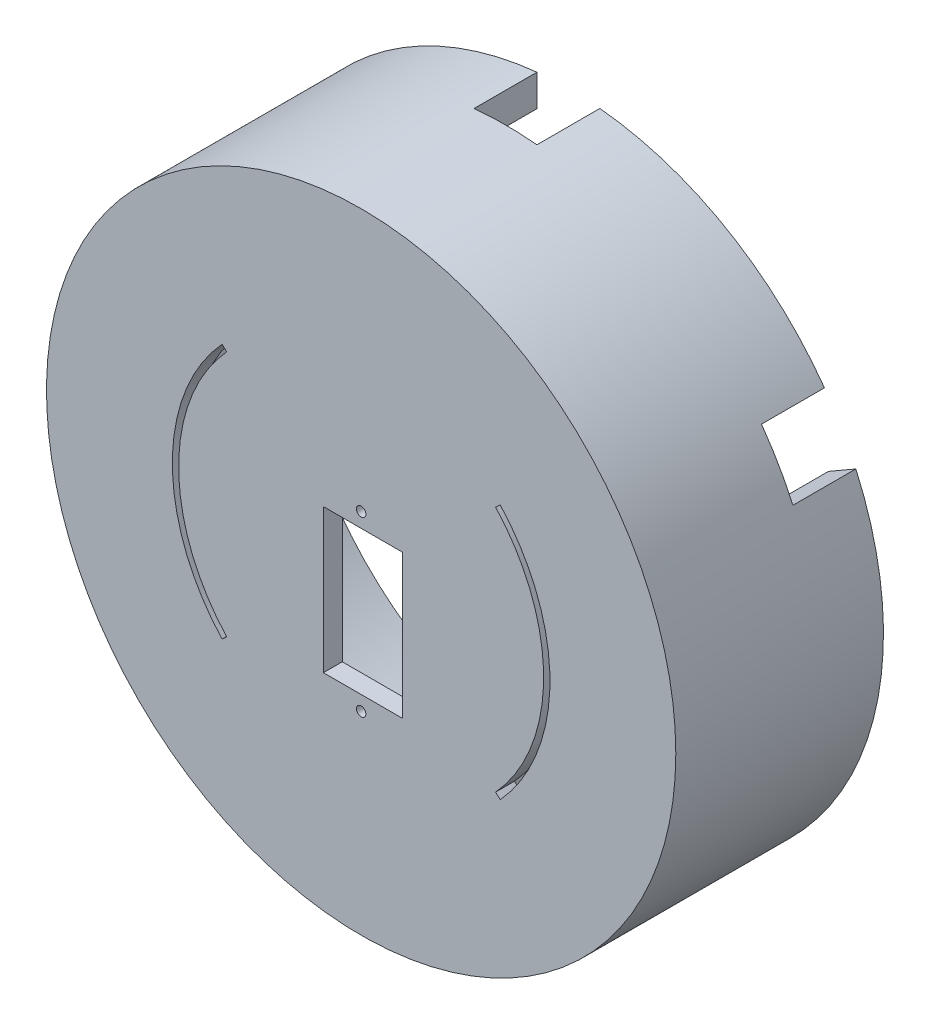
ISO-10303-21;
HEADER;
FILE_DESCRIPTION(('STEP AP214'),'2;1');
FILE_NAME('part.step','',(''),(''),'','','');
FILE_SCHEMA(('AUTOMOTIVE_DESIGN { 1 0 10303 214 1 1 1 1 }'));
ENDSEC;
DATA;
#1=APPLICATION_CONTEXT('core data for automotive mechanical design processes');
#2=APPLICATION_PROTOCOL_DEFINITION('international standard','automotive_design',2000,#1);
#3=PRODUCT_CONTEXT('',#1,'mechanical');
#4=PRODUCT('Part','Part','',(#3));
#5=PRODUCT_RELATED_PRODUCT_CATEGORY('part','',(#4));
#6=PRODUCT_DEFINITION_FORMATION('','',#4);
#7=PRODUCT_DEFINITION_CONTEXT('part definition',#1,'design');
#8=PRODUCT_DEFINITION('design','',#6,#7);
#9=PRODUCT_DEFINITION_SHAPE('','',#8);
#10=(LENGTH_UNIT() NAMED_UNIT(*) SI_UNIT(.MILLI.,.METRE.));
#11=(NAMED_UNIT(*) PLANE_ANGLE_UNIT() SI_UNIT($,.RADIAN.));
#12=(NAMED_UNIT(*) SI_UNIT($,.STERADIAN.) SOLID_ANGLE_UNIT());
#13=UNCERTAINTY_MEASURE_WITH_UNIT(LENGTH_MEASURE(1.E-05),#10,'distance_accuracy_value','');
#14=(GEOMETRIC_REPRESENTATION_CONTEXT(3) GLOBAL_UNCERTAINTY_ASSIGNED_CONTEXT((#13)) GLOBAL_UNIT_ASSIGNED_CONTEXT((#10,
#11,#12)) REPRESENTATION_CONTEXT('',''));
#15=CARTESIAN_POINT('',(0.,0.,0.));
#16=DIRECTION('',(0.,0.,1.));
#17=DIRECTION('',(1.,0.,0.));
#18=AXIS2_PLACEMENT_3D('',#15,#16,#17);
#19=CARTESIAN_POINT('',(0.299999999999826,16.8600000000008,0.));
#20=DIRECTION('',(0.,0.,1.));
#21=DIRECTION('',(1.,0.,0.));
#22=AXIS2_PLACEMENT_3D('',#19,#20,#21);
#23=PLANE('',#22);
#24=DIRECTION('',(-0.736746247058359,-0.676169333410962,0.));
#25=VECTOR('',#24,1.);
#26=CARTESIAN_POINT('',(0.300000000005249,16.8599999999949,0.));
#27=LINE('',#26,#25);
#28=CARTESIAN_POINT('',(22.4023874117628,37.1450800023299,0.));
#29=VERTEX_POINT('',#28);
#30=CARTESIAN_POINT('',(21.6656411647044,36.4689106689189,0.));
#31=VERTEX_POINT('',#30);
#32=EDGE_CURVE('E287',#29,#31,#27,.T.);
#33=ORIENTED_EDGE('',*,*,#32,.T.);
#34=CARTESIAN_POINT('',(0.300000000011957,16.860000000001,0.));
#35=DIRECTION('',(0.,0.,1.));
#36=DIRECTION('',(1.,0.,0.));
#37=AXIS2_PLACEMENT_3D('',#34,#35,#36);
#38=CIRCLE('',#37,29.0000000000001);
#39=CARTESIAN_POINT('',(21.6656411647044,-2.74891066891696,0.));
#40=VERTEX_POINT('',#39);
#41=EDGE_CURVE('E293',#31,#40,#38,.F.);
#42=ORIENTED_EDGE('',*,*,#41,.T.);
#43=DIRECTION('',(0.736746247058382,-0.676169333410936,0.));
#44=VECTOR('',#43,1.);
#45=CARTESIAN_POINT('',(0.300000000004796,16.8600000000062,0.));
#46=LINE('',#45,#44);
#47=CARTESIAN_POINT('',(22.4023874117628,-3.4250800023279,0.));
#48=VERTEX_POINT('',#47);
#49=EDGE_CURVE('E281',#40,#48,#46,.T.);
#50=ORIENTED_EDGE('',*,*,#49,.T.);
#51=CARTESIAN_POINT('',(0.300000000011957,16.860000000001,0.));
#52=DIRECTION('',(0.,0.,1.));
#53=DIRECTION('',(1.,0.,0.));
#54=AXIS2_PLACEMENT_3D('',#51,#52,#53);
#55=CIRCLE('',#54,30.0000000000001);
#56=EDGE_CURVE('E230',#48,#29,#55,.T.);
#57=ORIENTED_EDGE('',*,*,#56,.T.);
#58=EDGE_LOOP('',(#33,#42,#50,#57));
#59=FACE_BOUND('',#58,.T.);
#60=DIRECTION('',(0.736746247058359,0.676169333410962,0.));
#61=VECTOR('',#60,1.);
#62=CARTESIAN_POINT('',(0.300000000005277,16.8599999999948,0.));
#63=LINE('',#62,#61);
#64=CARTESIAN_POINT('',(-21.8023874117388,-3.42508000232792,0.));
#65=VERTEX_POINT('',#64);
#66=CARTESIAN_POINT('',(-21.0656411646805,-2.74891066891696,0.));
#67=VERTEX_POINT('',#66);
#68=EDGE_CURVE('E280',#65,#67,#63,.T.);
#69=ORIENTED_EDGE('',*,*,#68,.T.);
#70=CARTESIAN_POINT('',(0.300000000011957,16.860000000001,0.));
#71=DIRECTION('',(0.,0.,1.));
#72=DIRECTION('',(1.,0.,0.));
#73=AXIS2_PLACEMENT_3D('',#70,#71,#72);
#74=CIRCLE('',#73,29.0000000000001);
#75=CARTESIAN_POINT('',(-21.0656411646805,36.4689106689189,0.));
#76=VERTEX_POINT('',#75);
#77=EDGE_CURVE('E284',#67,#76,#74,.F.);
#78=ORIENTED_EDGE('',*,*,#77,.T.);
#79=DIRECTION('',(-0.736746247058359,0.676169333410962,0.));
#80=VECTOR('',#79,1.);
#81=CARTESIAN_POINT('',(0.300000000005497,16.8600000000069,0.));
#82=LINE('',#81,#80);
#83=CARTESIAN_POINT('',(-21.8023874117388,37.1450800023299,0.));
#84=VERTEX_POINT('',#83);
#85=EDGE_CURVE('E254',#76,#84,#82,.T.);
#86=ORIENTED_EDGE('',*,*,#85,.T.);
#87=CARTESIAN_POINT('',(0.300000000011957,16.860000000001,0.));
#88=DIRECTION('',(0.,0.,1.));
#89=DIRECTION('',(1.,0.,0.));
#90=AXIS2_PLACEMENT_3D('',#87,#88,#89);
#91=CIRCLE('',#90,30.0000000000001);
#92=EDGE_CURVE('E278',#84,#65,#91,.T.);
#93=ORIENTED_EDGE('',*,*,#92,.T.);
#94=EDGE_LOOP('',(#69,#78,#86,#93));
#95=FACE_BOUND('',#94,.T.);
#96=CARTESIAN_POINT('',(0.299999999999826,16.8600000000008,0.));
#97=DIRECTION('',(0.,0.,-1.));
#98=DIRECTION('',(-1.,0.,0.));
#99=AXIS2_PLACEMENT_3D('',#96,#97,#98);
#100=CIRCLE('',#99,45.);
#101=CARTESIAN_POINT('',(-44.7000000000002,16.8600000000008,0.));
#102=VERTEX_POINT('',#101);
#103=EDGE_CURVE('E407',#102,#102,#100,.T.);
#104=ORIENTED_EDGE('',*,*,#103,.T.);
#105=EDGE_LOOP('',(#104));
#106=FACE_BOUND('',#105,.T.);
#107=DIRECTION('',(0.,1.,0.));
#108=VECTOR('',#107,1.);
#109=CARTESIAN_POINT('',(-5.70000000000014,2.22044604925031E-13,0.));
#110=LINE('',#109,#108);
#111=CARTESIAN_POINT('',(-5.70000000000014,2.22044604925031E-13,0.));
#112=VERTEX_POINT('',#111);
#113=CARTESIAN_POINT('',(-5.70000000000014,22.8600000000002,0.));
#114=VERTEX_POINT('',#113);
#115=EDGE_CURVE('E296',#112,#114,#110,.T.);
#116=ORIENTED_EDGE('',*,*,#115,.F.);
#117=DIRECTION('',(-1.,0.,0.));
#118=VECTOR('',#117,1.);
#119=CARTESIAN_POINT('',(-5.70000000000014,2.22044604925031E-13,0.));
#120=LINE('',#119,#118);
#121=CARTESIAN_POINT('',(6.89999999999968,2.18575157973078E-13,0.));
#122=VERTEX_POINT('',#121);
#123=EDGE_CURVE('E311',#122,#112,#120,.T.);
#124=ORIENTED_EDGE('',*,*,#123,.F.);
#125=DIRECTION('',(0.,-1.,0.));
#126=VECTOR('',#125,1.);
#127=CARTESIAN_POINT('',(6.89999999999968,2.18575157973078E-13,0.));
#128=LINE('',#127,#126);
#129=CARTESIAN_POINT('',(6.89999999999968,22.8600000000002,0.));
#130=VERTEX_POINT('',#129);
#131=EDGE_CURVE('E328',#130,#122,#128,.T.);
#132=ORIENTED_EDGE('',*,*,#131,.F.);
#133=DIRECTION('',(1.,0.,0.));
#134=VECTOR('',#133,1.);
#135=CARTESIAN_POINT('',(-5.70000000000014,22.8600000000002,0.));
#136=LINE('',#135,#134);
#137=EDGE_CURVE('E322',#114,#130,#136,.T.);
#138=ORIENTED_EDGE('',*,*,#137,.F.);
#139=EDGE_LOOP('',(#116,#124,#132,#138));
#140=FACE_BOUND('',#139,.T.);
#141=CARTESIAN_POINT('',(0.299999999999826,-2.32,0.));
#142=DIRECTION('',(0.,0.,-1.));
#143=DIRECTION('',(-1.,0.,0.));
#144=AXIS2_PLACEMENT_3D('',#141,#142,#143);
#145=CIRCLE('',#144,0.75);
#146=CARTESIAN_POINT('',(-0.450000000000174,-2.32,0.));
#147=VERTEX_POINT('',#146);
#148=EDGE_CURVE('E294',#147,#147,#145,.T.);
#149=ORIENTED_EDGE('',*,*,#148,.F.);
#150=EDGE_LOOP('',(#149));
#151=FACE_BOUND('',#150,.T.);
#152=CARTESIAN_POINT('',(0.299999999999826,25.18,0.));
#153=DIRECTION('',(0.,0.,-1.));
#154=DIRECTION('',(-1.,0.,0.));
#155=AXIS2_PLACEMENT_3D('',#152,#153,#154);
#156=CIRCLE('',#155,0.75);
#157=CARTESIAN_POINT('',(-0.450000000000174,25.18,0.));
#158=VERTEX_POINT('',#157);
#159=EDGE_CURVE('E305',#158,#158,#156,.T.);
#160=ORIENTED_EDGE('',*,*,#159,.F.);
#161=EDGE_LOOP('',(#160));
#162=FACE_BOUND('',#161,.T.);
#163=ADVANCED_FACE('F39',(#59,#95,#106,#140,#151,#162),#23,.F.);
#164=CARTESIAN_POINT('',(0.299999999999826,16.8600000000008,-30.));
#165=DIRECTION('',(0.,0.,-1.));
#166=DIRECTION('',(-1.,0.,0.));
#167=AXIS2_PLACEMENT_3D('',#164,#165,#166);
#168=PLANE('',#167);
#169=DIRECTION('',(0.,1.,0.));
#170=VECTOR('',#169,1.);
#171=CARTESIAN_POINT('',(-4.76515575525249,-37.5201500632272,-30.));
#172=LINE('',#171,#170);
#173=CARTESIAN_POINT('',(-4.76515575525249,-32.8827803522778,-30.));
#174=VERTEX_POINT('',#173);
#175=CARTESIAN_POINT('',(-4.76515575525249,-27.8540268503628,-30.));
#176=VERTEX_POINT('',#175);
#177=EDGE_CURVE('E348',#174,#176,#172,.T.);
#178=ORIENTED_EDGE('',*,*,#177,.F.);
#179=CARTESIAN_POINT('',(0.299999999999826,16.8600000000008,-30.));
#180=DIRECTION('',(0.,0.,-1.));
#181=DIRECTION('',(-1.,0.,0.));
#182=AXIS2_PLACEMENT_3D('',#179,#180,#181);
#183=CIRCLE('',#182,50.);
#184=CARTESIAN_POINT('',(-45.2572757332887,37.464238101933,-30.));
#185=VERTEX_POINT('',#184);
#186=EDGE_CURVE('E418',#174,#185,#183,.T.);
#187=ORIENTED_EDGE('',*,*,#186,.T.);
#188=DIRECTION('',(-0.866025403784439,0.5,0.));
#189=VECTOR('',#188,1.);
#190=CARTESIAN_POINT('',(-49.2620135387394,39.7763745519439,-30.));
#191=LINE('',#190,#189);
#192=CARTESIAN_POINT('',(-40.9035226515969,34.9505975882331,-30.));
#193=VERTEX_POINT('',#192);
#194=EDGE_CURVE('E362',#193,#185,#191,.T.);
#195=ORIENTED_EDGE('',*,*,#194,.F.);
#196=CARTESIAN_POINT('',(0.299999999999826,16.8600000000008,-30.));
#197=DIRECTION('',(0.,0.,-1.));
#198=DIRECTION('',(-1.,0.,0.));
#199=AXIS2_PLACEMENT_3D('',#196,#197,#198);
#200=CIRCLE('',#199,45.);
#201=EDGE_CURVE('E410',#176,#193,#200,.T.);
#202=ORIENTED_EDGE('',*,*,#201,.F.);
#203=EDGE_LOOP('',(#178,#187,#195,#202));
#204=FACE_BOUND('',#203,.T.);
#205=ADVANCED_FACE('F517',(#204),#168,.T.);
#206=DIRECTION('',(0.866025403784439,0.5,0.));
#207=VECTOR('',#206,1.);
#208=CARTESIAN_POINT('',(44.9271692939914,48.3237755112857,-30.));
#209=LINE('',#208,#207);
#210=CARTESIAN_POINT('',(36.5686784068489,43.4979985475749,-30.));
#211=VERTEX_POINT('',#210);
#212=CARTESIAN_POINT('',(40.9224314885407,46.0116390612749,-30.));
#213=VERTEX_POINT('',#212);
#214=EDGE_CURVE('E347',#211,#213,#209,.T.);
#215=ORIENTED_EDGE('',*,*,#214,.F.);
#216=CARTESIAN_POINT('',(5.23484424474753,61.5885961358072,-30.));
#217=VERTEX_POINT('',#216);
#218=EDGE_CURVE('E467',#217,#211,#200,.T.);
#219=ORIENTED_EDGE('',*,*,#218,.F.);
#220=DIRECTION('',(0.,-1.,0.));
#221=VECTOR('',#220,1.);
#222=CARTESIAN_POINT('',(5.23484424474753,56.0497664051937,-30.));
#223=LINE('',#222,#221);
#224=CARTESIAN_POINT('',(5.23484424474753,66.6158771632071,-30.));
#225=VERTEX_POINT('',#224);
#226=EDGE_CURVE('E360',#225,#217,#223,.T.);
#227=ORIENTED_EDGE('',*,*,#226,.F.);
#228=EDGE_CURVE('E497',#225,#213,#183,.T.);
#229=ORIENTED_EDGE('',*,*,#228,.T.);
#230=EDGE_LOOP('',(#215,#219,#227,#229));
#231=FACE_BOUND('',#230,.T.);
#232=ADVANCED_FACE('F500',(#231),#168,.T.);
#233=DIRECTION('',(0.,1.,0.));
#234=VECTOR('',#233,1.);
#235=CARTESIAN_POINT('',(-4.76515575525249,56.0497664051937,-30.));
#236=LINE('',#235,#234);
#237=CARTESIAN_POINT('',(-4.76515575525249,61.5740268503643,-30.));
#238=VERTEX_POINT('',#237);
#239=CARTESIAN_POINT('',(-4.76515575525249,66.6027803522794,-30.));
#240=VERTEX_POINT('',#239);
#241=EDGE_CURVE('E358',#238,#240,#236,.T.);
#242=ORIENTED_EDGE('',*,*,#241,.F.);
#243=CARTESIAN_POINT('',(-35.8909052802884,43.603566983356,-30.));
#244=VERTEX_POINT('',#243);
#245=EDGE_CURVE('E412',#244,#238,#200,.T.);
#246=ORIENTED_EDGE('',*,*,#245,.F.);
#247=DIRECTION('',(0.866025403784438,-0.500000000000001,0.));
#248=VECTOR('',#247,1.);
#249=CARTESIAN_POINT('',(-44.2620135387394,48.4366285897882,-30.));
#250=LINE('',#249,#248);
#251=CARTESIAN_POINT('',(-40.2459335623167,46.1179437343136,-30.));
#252=VERTEX_POINT('',#251);
#253=EDGE_CURVE('E368',#252,#244,#250,.T.);
#254=ORIENTED_EDGE('',*,*,#253,.F.);
#255=EDGE_CURVE('E416',#252,#240,#183,.T.);
#256=ORIENTED_EDGE('',*,*,#255,.T.);
#257=EDGE_LOOP('',(#242,#246,#254,#256));
#258=FACE_BOUND('',#257,.T.);
#259=ADVANCED_FACE('F480',(#258),#168,.T.);
#260=CARTESIAN_POINT('',(0.299999999999826,16.8600000000008,3.));
#261=DIRECTION('',(0.,0.,-1.));
#262=DIRECTION('',(-1.,0.,0.));
#263=AXIS2_PLACEMENT_3D('',#260,#261,#262);
#264=CYLINDRICAL_SURFACE('',#263,50.);
#265=ORIENTED_EDGE('',*,*,#186,.F.);
#266=DIRECTION('',(0.,0.,-1.));
#267=VECTOR('',#266,1.);
#268=CARTESIAN_POINT('',(-4.76515575525249,-32.8827803522778,3.));
#269=LINE('',#268,#267);
#270=CARTESIAN_POINT('',(-4.76515575525249,-32.8827803522778,-20.));
#271=VERTEX_POINT('',#270);
#272=EDGE_CURVE('E403',#174,#271,#269,.F.);
#273=ORIENTED_EDGE('',*,*,#272,.T.);
#274=CARTESIAN_POINT('',(0.299999999999826,16.8600000000008,-20.));
#275=DIRECTION('',(0.,0.,1.));
#276=DIRECTION('',(1.,0.,0.));
#277=AXIS2_PLACEMENT_3D('',#274,#275,#276);
#278=CIRCLE('',#277,50.);
#279=CARTESIAN_POINT('',(5.23484424474751,-32.8958771632056,-20.));
#280=VERTEX_POINT('',#279);
#281=EDGE_CURVE('E400',#271,#280,#278,.T.);
#282=ORIENTED_EDGE('',*,*,#281,.T.);
#283=DIRECTION('',(0.,0.,-1.));
#284=VECTOR('',#283,1.);
#285=CARTESIAN_POINT('',(5.23484424474751,-32.8958771632056,3.));
#286=LINE('',#285,#284);
#287=CARTESIAN_POINT('',(5.23484424474751,-32.8958771632056,-30.));
#288=VERTEX_POINT('',#287);
#289=EDGE_CURVE('E405',#280,#288,#286,.T.);
#290=ORIENTED_EDGE('',*,*,#289,.T.);
#291=CARTESIAN_POINT('',(45.9110893175687,37.3448366179666,-30.));
#292=VERTEX_POINT('',#291);
#293=EDGE_CURVE('E420',#292,#288,#183,.T.);
#294=ORIENTED_EDGE('',*,*,#293,.F.);
#295=DIRECTION('',(0.,0.,-1.));
#296=VECTOR('',#295,1.);
#297=CARTESIAN_POINT('',(45.9110893175687,37.3448366179666,3.));
#298=LINE('',#297,#296);
#299=CARTESIAN_POINT('',(45.9110893175687,37.3448366179666,-20.));
#300=VERTEX_POINT('',#299);
#301=EDGE_CURVE('E398',#292,#300,#298,.F.);
#302=ORIENTED_EDGE('',*,*,#301,.T.);
#303=CARTESIAN_POINT('',(0.299999999999826,16.8600000000008,-20.));
#304=DIRECTION('',(0.,0.,-1.));
#305=DIRECTION('',(-1.,0.,0.));
#306=AXIS2_PLACEMENT_3D('',#303,#304,#305);
#307=CIRCLE('',#306,50.);
#308=CARTESIAN_POINT('',(40.9224314885407,46.0116390612749,-20.));
#309=VERTEX_POINT('',#308);
#310=EDGE_CURVE('E393',#309,#300,#307,.T.);
#311=ORIENTED_EDGE('',*,*,#310,.F.);
#312=DIRECTION('',(0.,0.,-1.));
#313=VECTOR('',#312,1.);
#314=CARTESIAN_POINT('',(40.9224314885407,46.0116390612749,3.));
#315=LINE('',#314,#313);
#316=EDGE_CURVE('E392',#309,#213,#315,.T.);
#317=ORIENTED_EDGE('',*,*,#316,.T.);
#318=ORIENTED_EDGE('',*,*,#228,.F.);
#319=DIRECTION('',(0.,0.,-1.));
#320=VECTOR('',#319,1.);
#321=CARTESIAN_POINT('',(5.23484424474753,66.6158771632071,3.));
#322=LINE('',#321,#320);
#323=CARTESIAN_POINT('',(5.23484424474753,66.6158771632071,-20.));
#324=VERTEX_POINT('',#323);
#325=EDGE_CURVE('E383',#225,#324,#322,.F.);
#326=ORIENTED_EDGE('',*,*,#325,.T.);
#327=CARTESIAN_POINT('',(0.299999999999826,16.8600000000008,-20.));
#328=DIRECTION('',(0.,0.,1.));
#329=DIRECTION('',(1.,0.,0.));
#330=AXIS2_PLACEMENT_3D('',#327,#328,#329);
#331=CIRCLE('',#330,50.);
#332=CARTESIAN_POINT('',(-4.76515575525249,66.6027803522794,-20.));
#333=VERTEX_POINT('',#332);
#334=EDGE_CURVE('E385',#324,#333,#331,.T.);
#335=ORIENTED_EDGE('',*,*,#334,.T.);
#336=DIRECTION('',(0.,0.,-1.));
#337=VECTOR('',#336,1.);
#338=CARTESIAN_POINT('',(-4.76515575525249,66.6027803522794,3.));
#339=LINE('',#338,#337);
#340=EDGE_CURVE('E387',#333,#240,#339,.T.);
#341=ORIENTED_EDGE('',*,*,#340,.T.);
#342=ORIENTED_EDGE('',*,*,#255,.F.);
#343=DIRECTION('',(0.,0.,-1.));
#344=VECTOR('',#343,1.);
#345=CARTESIAN_POINT('',(-40.2459335623167,46.1179437343136,3.));
#346=LINE('',#345,#344);
#347=CARTESIAN_POINT('',(-40.2459335623167,46.1179437343136,-20.));
#348=VERTEX_POINT('',#347);
#349=EDGE_CURVE('E378',#252,#348,#346,.F.);
#350=ORIENTED_EDGE('',*,*,#349,.T.);
#351=CARTESIAN_POINT('',(0.299999999999826,16.8600000000008,-20.));
#352=DIRECTION('',(0.,0.,-1.));
#353=DIRECTION('',(-1.,0.,0.));
#354=AXIS2_PLACEMENT_3D('',#351,#352,#353);
#355=CIRCLE('',#354,50.);
#356=CARTESIAN_POINT('',(-45.2572757332887,37.464238101933,-20.));
#357=VERTEX_POINT('',#356);
#358=EDGE_CURVE('E341',#357,#348,#355,.T.);
#359=ORIENTED_EDGE('',*,*,#358,.F.);
#360=DIRECTION('',(0.,0.,-1.));
#361=VECTOR('',#360,1.);
#362=CARTESIAN_POINT('',(-45.2572757332887,37.464238101933,3.));
#363=LINE('',#362,#361);
#364=EDGE_CURVE('E376',#357,#185,#363,.T.);
#365=ORIENTED_EDGE('',*,*,#364,.T.);
#366=EDGE_LOOP('',(#265,#273,#282,#290,#294,#302,#311,#317,#318,#326,#335,#341,#342,#350,#359,#365));
#367=FACE_BOUND('',#366,.T.);
#368=CARTESIAN_POINT('',(0.299999999999826,16.8600000000008,3.));
#369=DIRECTION('',(0.,0.,1.));
#370=DIRECTION('',(1.,0.,0.));
#371=AXIS2_PLACEMENT_3D('',#368,#369,#370);
#372=CIRCLE('',#371,50.);
#373=CARTESIAN_POINT('',(50.2999999999998,16.8600000000008,3.));
#374=VERTEX_POINT('',#373);
#375=EDGE_CURVE('E423',#374,#374,#372,.T.);
#376=ORIENTED_EDGE('',*,*,#375,.F.);
#377=EDGE_LOOP('',(#376));
#378=FACE_BOUND('',#377,.T.);
#379=ADVANCED_FACE('F41',(#367,#378),#264,.T.);
#380=CARTESIAN_POINT('',(0.299999999999826,16.8600000000008,3.));
#381=DIRECTION('',(0.,0.,1.));
#382=DIRECTION('',(1.,0.,0.));
#383=AXIS2_PLACEMENT_3D('',#380,#381,#382);
#384=PLANE('',#383);
#385=CARTESIAN_POINT('',(0.300000000011957,16.860000000001,3.));
#386=DIRECTION('',(0.,0.,-1.));
#387=DIRECTION('',(1.,0.,0.));
#388=AXIS2_PLACEMENT_3D('',#385,#386,#387);
#389=CIRCLE('',#388,29.0000000000001);
#390=CARTESIAN_POINT('',(21.6656411647044,36.4689106689189,3.));
#391=VERTEX_POINT('',#390);
#392=CARTESIAN_POINT('',(21.6656411647044,-2.74891066891696,3.));
#393=VERTEX_POINT('',#392);
#394=EDGE_CURVE('E241',#391,#393,#389,.T.);
#395=ORIENTED_EDGE('',*,*,#394,.F.);
#396=DIRECTION('',(-0.736746247058359,-0.676169333410962,0.));
#397=VECTOR('',#396,1.);
#398=CARTESIAN_POINT('',(21.6656411647044,36.4689106689189,3.));
#399=LINE('',#398,#397);
#400=CARTESIAN_POINT('',(22.4023874117628,37.1450800023299,3.));
#401=VERTEX_POINT('',#400);
#402=EDGE_CURVE('E246',#401,#391,#399,.T.);
#403=ORIENTED_EDGE('',*,*,#402,.F.);
#404=CARTESIAN_POINT('',(0.300000000011957,16.860000000001,3.));
#405=DIRECTION('',(0.,0.,1.));
#406=DIRECTION('',(1.,0.,0.));
#407=AXIS2_PLACEMENT_3D('',#404,#405,#406);
#408=CIRCLE('',#407,30.0000000000001);
#409=CARTESIAN_POINT('',(22.4023874117628,-3.4250800023279,3.));
#410=VERTEX_POINT('',#409);
#411=EDGE_CURVE('E228',#410,#401,#408,.T.);
#412=ORIENTED_EDGE('',*,*,#411,.F.);
#413=DIRECTION('',(0.736746247058382,-0.676169333410936,0.));
#414=VECTOR('',#413,1.);
#415=CARTESIAN_POINT('',(21.6656411647044,-2.74891066891696,3.));
#416=LINE('',#415,#414);
#417=EDGE_CURVE('E236',#393,#410,#416,.T.);
#418=ORIENTED_EDGE('',*,*,#417,.F.);
#419=EDGE_LOOP('',(#395,#403,#412,#418));
#420=FACE_BOUND('',#419,.T.);
#421=CARTESIAN_POINT('',(0.300000000011957,16.860000000001,3.));
#422=DIRECTION('',(0.,0.,-1.));
#423=DIRECTION('',(1.,0.,0.));
#424=AXIS2_PLACEMENT_3D('',#421,#422,#423);
#425=CIRCLE('',#424,29.0000000000001);
#426=CARTESIAN_POINT('',(-21.0656411646805,-2.74891066891696,3.));
#427=VERTEX_POINT('',#426);
#428=CARTESIAN_POINT('',(-21.0656411646805,36.4689106689189,3.));
#429=VERTEX_POINT('',#428);
#430=EDGE_CURVE('E275',#427,#429,#425,.T.);
#431=ORIENTED_EDGE('',*,*,#430,.F.);
#432=DIRECTION('',(0.736746247058359,0.676169333410961,0.));
#433=VECTOR('',#432,1.);
#434=CARTESIAN_POINT('',(-21.8023874117388,-3.42508000232792,3.));
#435=LINE('',#434,#433);
#436=CARTESIAN_POINT('',(-21.8023874117388,-3.42508000232792,3.));
#437=VERTEX_POINT('',#436);
#438=EDGE_CURVE('E260',#437,#427,#435,.T.);
#439=ORIENTED_EDGE('',*,*,#438,.F.);
#440=CARTESIAN_POINT('',(0.300000000011957,16.860000000001,3.));
#441=DIRECTION('',(0.,0.,1.));
#442=DIRECTION('',(1.,0.,0.));
#443=AXIS2_PLACEMENT_3D('',#440,#441,#442);
#444=CIRCLE('',#443,30.0000000000001);
#445=CARTESIAN_POINT('',(-21.8023874117388,37.1450800023299,3.));
#446=VERTEX_POINT('',#445);
#447=EDGE_CURVE('E269',#446,#437,#444,.T.);
#448=ORIENTED_EDGE('',*,*,#447,.F.);
#449=DIRECTION('',(-0.736746247058359,0.676169333410962,0.));
#450=VECTOR('',#449,1.);
#451=CARTESIAN_POINT('',(-21.8023874117388,37.1450800023299,3.));
#452=LINE('',#451,#450);
#453=EDGE_CURVE('E266',#429,#446,#452,.T.);
#454=ORIENTED_EDGE('',*,*,#453,.F.);
#455=EDGE_LOOP('',(#431,#439,#448,#454));
#456=FACE_BOUND('',#455,.T.);
#457=CARTESIAN_POINT('',(0.299999999999826,25.18,3.));
#458=DIRECTION('',(0.,0.,-1.));
#459=DIRECTION('',(-1.,0.,0.));
#460=AXIS2_PLACEMENT_3D('',#457,#458,#459);
#461=CIRCLE('',#460,0.75);
#462=CARTESIAN_POINT('',(-0.450000000000174,25.18,3.));
#463=VERTEX_POINT('',#462);
#464=EDGE_CURVE('E295',#463,#463,#461,.T.);
#465=ORIENTED_EDGE('',*,*,#464,.T.);
#466=EDGE_LOOP('',(#465));
#467=FACE_BOUND('',#466,.T.);
#468=CARTESIAN_POINT('',(0.299999999999826,-2.32,3.));
#469=DIRECTION('',(0.,0.,-1.));
#470=DIRECTION('',(-1.,0.,0.));
#471=AXIS2_PLACEMENT_3D('',#468,#469,#470);
#472=CIRCLE('',#471,0.75);
#473=CARTESIAN_POINT('',(-0.450000000000174,-2.32,3.));
#474=VERTEX_POINT('',#473);
#475=EDGE_CURVE('E299',#474,#474,#472,.T.);
#476=ORIENTED_EDGE('',*,*,#475,.T.);
#477=EDGE_LOOP('',(#476));
#478=FACE_BOUND('',#477,.T.);
#479=DIRECTION('',(0.,1.,0.));
#480=VECTOR('',#479,1.);
#481=CARTESIAN_POINT('',(-5.70000000000014,2.22044604925031E-13,3.));
#482=LINE('',#481,#480);
#483=CARTESIAN_POINT('',(-5.70000000000014,2.22044604925031E-13,3.));
#484=VERTEX_POINT('',#483);
#485=CARTESIAN_POINT('',(-5.70000000000014,22.8600000000002,3.));
#486=VERTEX_POINT('',#485);
#487=EDGE_CURVE('E310',#484,#486,#482,.T.);
#488=ORIENTED_EDGE('',*,*,#487,.T.);
#489=DIRECTION('',(1.,0.,0.));
#490=VECTOR('',#489,1.);
#491=CARTESIAN_POINT('',(-5.70000000000014,22.8600000000002,3.));
#492=LINE('',#491,#490);
#493=CARTESIAN_POINT('',(6.89999999999968,22.8600000000002,3.));
#494=VERTEX_POINT('',#493);
#495=EDGE_CURVE('E309',#486,#494,#492,.T.);
#496=ORIENTED_EDGE('',*,*,#495,.T.);
#497=DIRECTION('',(0.,-1.,0.));
#498=VECTOR('',#497,1.);
#499=CARTESIAN_POINT('',(6.89999999999968,2.18575157973078E-13,3.));
#500=LINE('',#499,#498);
#501=CARTESIAN_POINT('',(6.89999999999968,2.18575157973078E-13,3.));
#502=VERTEX_POINT('',#501);
#503=EDGE_CURVE('E313',#494,#502,#500,.T.);
#504=ORIENTED_EDGE('',*,*,#503,.T.);
#505=DIRECTION('',(-1.,0.,0.));
#506=VECTOR('',#505,1.);
#507=CARTESIAN_POINT('',(-5.70000000000014,2.22044604925031E-13,3.));
#508=LINE('',#507,#506);
#509=EDGE_CURVE('E320',#502,#484,#508,.T.);
#510=ORIENTED_EDGE('',*,*,#509,.T.);
#511=EDGE_LOOP('',(#488,#496,#504,#510));
#512=FACE_BOUND('',#511,.T.);
#513=ORIENTED_EDGE('',*,*,#375,.T.);
#514=EDGE_LOOP('',(#513));
#515=FACE_BOUND('',#514,.T.);
#516=ADVANCED_FACE('F243',(#420,#456,#467,#478,#512,#515),#384,.T.);
#517=DIRECTION('',(0.,-1.,0.));
#518=VECTOR('',#517,1.);
#519=CARTESIAN_POINT('',(5.23484424474751,-37.5201500632272,-30.));
#520=LINE('',#519,#518);
#521=CARTESIAN_POINT('',(5.23484424474751,-27.8685961358057,-30.));
#522=VERTEX_POINT('',#521);
#523=EDGE_CURVE('E344',#522,#288,#520,.T.);
#524=ORIENTED_EDGE('',*,*,#523,.F.);
#525=CARTESIAN_POINT('',(41.5560610355403,34.8304598670091,-30.));
#526=VERTEX_POINT('',#525);
#527=EDGE_CURVE('E414',#526,#522,#200,.T.);
#528=ORIENTED_EDGE('',*,*,#527,.F.);
#529=DIRECTION('',(-0.866025403784439,-0.5,0.));
#530=VECTOR('',#529,1.);
#531=CARTESIAN_POINT('',(49.9271692939914,39.6635214734413,-30.));
#532=LINE('',#531,#530);
#533=EDGE_CURVE('E346',#292,#526,#532,.T.);
#534=ORIENTED_EDGE('',*,*,#533,.F.);
#535=ORIENTED_EDGE('',*,*,#293,.T.);
#536=EDGE_LOOP('',(#524,#528,#534,#535));
#537=FACE_BOUND('',#536,.T.);
#538=ADVANCED_FACE('F460',(#537),#168,.T.);
#539=CARTESIAN_POINT('',(0.299999999999826,16.8600000000008,-30.));
#540=DIRECTION('',(0.,0.,1.));
#541=DIRECTION('',(1.,0.,0.));
#542=AXIS2_PLACEMENT_3D('',#539,#540,#541);
#543=CYLINDRICAL_SURFACE('',#542,45.);
#544=DIRECTION('',(0.,0.,1.));
#545=VECTOR('',#544,1.);
#546=CARTESIAN_POINT('',(-4.76515575525249,-27.8540268503628,-30.));
#547=LINE('',#546,#545);
#548=CARTESIAN_POINT('',(-4.76515575525249,-27.8540268503628,-20.));
#549=VERTEX_POINT('',#548);
#550=EDGE_CURVE('E11',#176,#549,#547,.T.);
#551=ORIENTED_EDGE('',*,*,#550,.F.);
#552=ORIENTED_EDGE('',*,*,#201,.T.);
#553=DIRECTION('',(0.,0.,1.));
#554=VECTOR('',#553,1.);
#555=CARTESIAN_POINT('',(-40.9035226515969,34.9505975882331,-30.));
#556=LINE('',#555,#554);
#557=CARTESIAN_POINT('',(-40.9035226515969,34.9505975882331,-20.));
#558=VERTEX_POINT('',#557);
#559=EDGE_CURVE('E430',#558,#193,#556,.F.);
#560=ORIENTED_EDGE('',*,*,#559,.F.);
#561=CARTESIAN_POINT('',(0.299999999999826,16.8600000000008,-20.));
#562=DIRECTION('',(0.,0.,-1.));
#563=DIRECTION('',(-1.,0.,0.));
#564=AXIS2_PLACEMENT_3D('',#561,#562,#563);
#565=CIRCLE('',#564,45.);
#566=CARTESIAN_POINT('',(-35.8909052802884,43.603566983356,-20.));
#567=VERTEX_POINT('',#566);
#568=EDGE_CURVE('E425',#558,#567,#565,.T.);
#569=ORIENTED_EDGE('',*,*,#568,.T.);
#570=DIRECTION('',(0.,0.,1.));
#571=VECTOR('',#570,1.);
#572=CARTESIAN_POINT('',(-35.8909052802884,43.603566983356,-30.));
#573=LINE('',#572,#571);
#574=EDGE_CURVE('E429',#244,#567,#573,.T.);
#575=ORIENTED_EDGE('',*,*,#574,.F.);
#576=ORIENTED_EDGE('',*,*,#245,.T.);
#577=DIRECTION('',(0.,0.,1.));
#578=VECTOR('',#577,1.);
#579=CARTESIAN_POINT('',(-4.76515575525249,61.5740268503643,-30.));
#580=LINE('',#579,#578);
#581=CARTESIAN_POINT('',(-4.76515575525249,61.5740268503643,-20.));
#582=VERTEX_POINT('',#581);
#583=EDGE_CURVE('E440',#582,#238,#580,.F.);
#584=ORIENTED_EDGE('',*,*,#583,.F.);
#585=CARTESIAN_POINT('',(0.299999999999826,16.8600000000008,-20.));
#586=DIRECTION('',(0.,0.,1.));
#587=DIRECTION('',(1.,0.,0.));
#588=AXIS2_PLACEMENT_3D('',#585,#586,#587);
#589=CIRCLE('',#588,45.);
#590=CARTESIAN_POINT('',(5.23484424474753,61.5885961358072,-20.));
#591=VERTEX_POINT('',#590);
#592=EDGE_CURVE('E435',#591,#582,#589,.T.);
#593=ORIENTED_EDGE('',*,*,#592,.F.);
#594=DIRECTION('',(0.,0.,1.));
#595=VECTOR('',#594,1.);
#596=CARTESIAN_POINT('',(5.23484424474753,61.5885961358072,-30.));
#597=LINE('',#596,#595);
#598=EDGE_CURVE('E432',#217,#591,#597,.T.);
#599=ORIENTED_EDGE('',*,*,#598,.F.);
#600=ORIENTED_EDGE('',*,*,#218,.T.);
#601=DIRECTION('',(0.,0.,1.));
#602=VECTOR('',#601,1.);
#603=CARTESIAN_POINT('',(36.5686784068489,43.4979985475749,-30.));
#604=LINE('',#603,#602);
#605=CARTESIAN_POINT('',(36.5686784068489,43.4979985475749,-20.));
#606=VERTEX_POINT('',#605);
#607=EDGE_CURVE('E445',#606,#211,#604,.F.);
#608=ORIENTED_EDGE('',*,*,#607,.F.);
#609=CARTESIAN_POINT('',(0.299999999999826,16.8600000000008,-20.));
#610=DIRECTION('',(0.,0.,-1.));
#611=DIRECTION('',(-1.,0.,0.));
#612=AXIS2_PLACEMENT_3D('',#609,#610,#611);
#613=CIRCLE('',#612,45.);
#614=CARTESIAN_POINT('',(41.5560610355403,34.8304598670091,-20.));
#615=VERTEX_POINT('',#614);
#616=EDGE_CURVE('E437',#606,#615,#613,.T.);
#617=ORIENTED_EDGE('',*,*,#616,.T.);
#618=DIRECTION('',(0.,0.,1.));
#619=VECTOR('',#618,1.);
#620=CARTESIAN_POINT('',(41.5560610355403,34.8304598670091,-30.));
#621=LINE('',#620,#619);
#622=EDGE_CURVE('E443',#526,#615,#621,.T.);
#623=ORIENTED_EDGE('',*,*,#622,.F.);
#624=ORIENTED_EDGE('',*,*,#527,.T.);
#625=DIRECTION('',(0.,0.,1.));
#626=VECTOR('',#625,1.);
#627=CARTESIAN_POINT('',(5.23484424474751,-27.8685961358057,-30.));
#628=LINE('',#627,#626);
#629=CARTESIAN_POINT('',(5.23484424474751,-27.8685961358057,-20.));
#630=VERTEX_POINT('',#629);
#631=EDGE_CURVE('E50',#630,#522,#628,.F.);
#632=ORIENTED_EDGE('',*,*,#631,.F.);
#633=CARTESIAN_POINT('',(0.299999999999826,16.8600000000008,-20.));
#634=DIRECTION('',(0.,0.,1.));
#635=DIRECTION('',(1.,0.,0.));
#636=AXIS2_PLACEMENT_3D('',#633,#634,#635);
#637=CIRCLE('',#636,45.);
#638=EDGE_CURVE('E450',#549,#630,#637,.T.);
#639=ORIENTED_EDGE('',*,*,#638,.F.);
#640=EDGE_LOOP('',(#551,#552,#560,#569,#575,#576,#584,#593,#599,#600,#608,#617,#623,#624,#632,#639));
#641=FACE_BOUND('',#640,.T.);
#642=ORIENTED_EDGE('',*,*,#103,.F.);
#643=EDGE_LOOP('',(#642));
#644=FACE_BOUND('',#643,.T.);
#645=ADVANCED_FACE('F465',(#641,#644),#543,.F.);
#646=CARTESIAN_POINT('',(-44.2620135387394,48.4366285897882,-20.));
#647=DIRECTION('',(0.500000000000001,0.866025403784438,0.));
#648=DIRECTION('',(-0.866025403784438,0.500000000000001,0.));
#649=AXIS2_PLACEMENT_3D('',#646,#647,#648);
#650=PLANE('',#649);
#651=ORIENTED_EDGE('',*,*,#253,.T.);
#652=ORIENTED_EDGE('',*,*,#574,.T.);
#653=DIRECTION('',(0.866025403784438,-0.500000000000001,0.));
#654=VECTOR('',#653,1.);
#655=CARTESIAN_POINT('',(-44.2620135387394,48.4366285897882,-20.));
#656=LINE('',#655,#654);
#657=EDGE_CURVE('E334',#348,#567,#656,.T.);
#658=ORIENTED_EDGE('',*,*,#657,.F.);
#659=ORIENTED_EDGE('',*,*,#349,.F.);
#660=EDGE_LOOP('',(#651,#652,#658,#659));
#661=FACE_BOUND('',#660,.T.);
#662=ADVANCED_FACE('F529',(#661),#650,.F.);
#663=CARTESIAN_POINT('',(-49.2620135387394,39.7763745519439,-20.));
#664=DIRECTION('',(-0.5,-0.866025403784438,0.));
#665=DIRECTION('',(0.866025403784438,-0.5,0.));
#666=AXIS2_PLACEMENT_3D('',#663,#664,#665);
#667=PLANE('',#666);
#668=DIRECTION('',(-0.866025403784439,0.5,0.));
#669=VECTOR('',#668,1.);
#670=CARTESIAN_POINT('',(-49.2620135387394,39.7763745519439,-20.));
#671=LINE('',#670,#669);
#672=EDGE_CURVE('E369',#558,#357,#671,.T.);
#673=ORIENTED_EDGE('',*,*,#672,.F.);
#674=ORIENTED_EDGE('',*,*,#559,.T.);
#675=ORIENTED_EDGE('',*,*,#194,.T.);
#676=ORIENTED_EDGE('',*,*,#364,.F.);
#677=EDGE_LOOP('',(#673,#674,#675,#676));
#678=FACE_BOUND('',#677,.T.);
#679=ADVANCED_FACE('F523',(#678),#667,.F.);
#680=CARTESIAN_POINT('',(0.,0.,-20.));
#681=DIRECTION('',(0.,0.,-1.));
#682=DIRECTION('',(-1.,0.,0.));
#683=AXIS2_PLACEMENT_3D('',#680,#681,#682);
#684=PLANE('',#683);
#685=ORIENTED_EDGE('',*,*,#358,.T.);
#686=ORIENTED_EDGE('',*,*,#657,.T.);
#687=ORIENTED_EDGE('',*,*,#568,.F.);
#688=ORIENTED_EDGE('',*,*,#672,.T.);
#689=EDGE_LOOP('',(#685,#686,#687,#688));
#690=FACE_BOUND('',#689,.T.);
#691=ADVANCED_FACE('F521',(#690),#684,.T.);
#692=CARTESIAN_POINT('',(-4.76515575525249,56.0497664051937,-20.));
#693=DIRECTION('',(-1.,0.,0.));
#694=DIRECTION('',(0.,0.,1.));
#695=AXIS2_PLACEMENT_3D('',#692,#693,#694);
#696=PLANE('',#695);
#697=DIRECTION('',(0.,1.,0.));
#698=VECTOR('',#697,1.);
#699=CARTESIAN_POINT('',(-4.76515575525249,56.0497664051937,-20.));
#700=LINE('',#699,#698);
#701=EDGE_CURVE('E363',#582,#333,#700,.T.);
#702=ORIENTED_EDGE('',*,*,#701,.F.);
#703=ORIENTED_EDGE('',*,*,#583,.T.);
#704=ORIENTED_EDGE('',*,*,#241,.T.);
#705=ORIENTED_EDGE('',*,*,#340,.F.);
#706=EDGE_LOOP('',(#702,#703,#704,#705));
#707=FACE_BOUND('',#706,.T.);
#708=ADVANCED_FACE('F485',(#707),#696,.F.);
#709=CARTESIAN_POINT('',(5.23484424474753,56.0497664051937,-20.));
#710=DIRECTION('',(1.,0.,0.));
#711=DIRECTION('',(0.,0.,-1.));
#712=AXIS2_PLACEMENT_3D('',#709,#710,#711);
#713=PLANE('',#712);
#714=ORIENTED_EDGE('',*,*,#226,.T.);
#715=ORIENTED_EDGE('',*,*,#598,.T.);
#716=DIRECTION('',(0.,-1.,0.));
#717=VECTOR('',#716,1.);
#718=CARTESIAN_POINT('',(5.23484424474753,56.0497664051937,-20.));
#719=LINE('',#718,#717);
#720=EDGE_CURVE('E361',#324,#591,#719,.T.);
#721=ORIENTED_EDGE('',*,*,#720,.F.);
#722=ORIENTED_EDGE('',*,*,#325,.F.);
#723=EDGE_LOOP('',(#714,#715,#721,#722));
#724=FACE_BOUND('',#723,.T.);
#725=ADVANCED_FACE('F491',(#724),#713,.F.);
#726=CARTESIAN_POINT('',(0.,0.,-20.));
#727=DIRECTION('',(0.,0.,1.));
#728=DIRECTION('',(1.,0.,0.));
#729=AXIS2_PLACEMENT_3D('',#726,#727,#728);
#730=PLANE('',#729);
#731=ORIENTED_EDGE('',*,*,#720,.T.);
#732=ORIENTED_EDGE('',*,*,#592,.T.);
#733=ORIENTED_EDGE('',*,*,#701,.T.);
#734=ORIENTED_EDGE('',*,*,#334,.F.);
#735=EDGE_LOOP('',(#731,#732,#733,#734));
#736=FACE_BOUND('',#735,.T.);
#737=ADVANCED_FACE('F493',(#736),#730,.F.);
#738=CARTESIAN_POINT('',(49.9271692939914,39.6635214734413,-20.));
#739=DIRECTION('',(0.5,-0.866025403784439,0.));
#740=DIRECTION('',(0.866025403784439,0.5,0.));
#741=AXIS2_PLACEMENT_3D('',#738,#739,#740);
#742=PLANE('',#741);
#743=ORIENTED_EDGE('',*,*,#533,.T.);
#744=ORIENTED_EDGE('',*,*,#622,.T.);
#745=DIRECTION('',(-0.866025403784439,-0.5,0.));
#746=VECTOR('',#745,1.);
#747=CARTESIAN_POINT('',(49.9271692939914,39.6635214734413,-20.));
#748=LINE('',#747,#746);
#749=EDGE_CURVE('E355',#300,#615,#748,.T.);
#750=ORIENTED_EDGE('',*,*,#749,.F.);
#751=ORIENTED_EDGE('',*,*,#301,.F.);
#752=EDGE_LOOP('',(#743,#744,#750,#751));
#753=FACE_BOUND('',#752,.T.);
#754=ADVANCED_FACE('F507',(#753),#742,.F.);
#755=CARTESIAN_POINT('',(44.9271692939914,48.3237755112857,-20.));
#756=DIRECTION('',(-0.5,0.866025403784439,0.));
#757=DIRECTION('',(-0.866025403784439,-0.5,0.));
#758=AXIS2_PLACEMENT_3D('',#755,#756,#757);
#759=PLANE('',#758);
#760=DIRECTION('',(0.866025403784439,0.5,0.));
#761=VECTOR('',#760,1.);
#762=CARTESIAN_POINT('',(44.9271692939914,48.3237755112857,-20.));
#763=LINE('',#762,#761);
#764=EDGE_CURVE('E354',#606,#309,#763,.T.);
#765=ORIENTED_EDGE('',*,*,#764,.F.);
#766=ORIENTED_EDGE('',*,*,#607,.T.);
#767=ORIENTED_EDGE('',*,*,#214,.T.);
#768=ORIENTED_EDGE('',*,*,#316,.F.);
#769=EDGE_LOOP('',(#765,#766,#767,#768));
#770=FACE_BOUND('',#769,.T.);
#771=ADVANCED_FACE('F505',(#770),#759,.F.);
#772=CARTESIAN_POINT('',(0.,0.,-20.));
#773=DIRECTION('',(0.,0.,-1.));
#774=DIRECTION('',(-1.,0.,0.));
#775=AXIS2_PLACEMENT_3D('',#772,#773,#774);
#776=PLANE('',#775);
#777=ORIENTED_EDGE('',*,*,#310,.T.);
#778=ORIENTED_EDGE('',*,*,#749,.T.);
#779=ORIENTED_EDGE('',*,*,#616,.F.);
#780=ORIENTED_EDGE('',*,*,#764,.T.);
#781=EDGE_LOOP('',(#777,#778,#779,#780));
#782=FACE_BOUND('',#781,.T.);
#783=ADVANCED_FACE('F506',(#782),#776,.T.);
#784=CARTESIAN_POINT('',(-4.76515575525249,-37.5201500632272,-20.));
#785=DIRECTION('',(-1.,0.,0.));
#786=DIRECTION('',(0.,0.,1.));
#787=AXIS2_PLACEMENT_3D('',#784,#785,#786);
#788=PLANE('',#787);
#789=ORIENTED_EDGE('',*,*,#177,.T.);
#790=ORIENTED_EDGE('',*,*,#550,.T.);
#791=DIRECTION('',(0.,1.,0.));
#792=VECTOR('',#791,1.);
#793=CARTESIAN_POINT('',(-4.76515575525249,-37.5201500632272,-20.));
#794=LINE('',#793,#792);
#795=EDGE_CURVE('E339',#271,#549,#794,.T.);
#796=ORIENTED_EDGE('',*,*,#795,.F.);
#797=ORIENTED_EDGE('',*,*,#272,.F.);
#798=EDGE_LOOP('',(#789,#790,#796,#797));
#799=FACE_BOUND('',#798,.T.);
#800=ADVANCED_FACE('F567',(#799),#788,.F.);
#801=CARTESIAN_POINT('',(5.23484424474751,-37.5201500632272,-20.));
#802=DIRECTION('',(1.,0.,0.));
#803=DIRECTION('',(0.,0.,-1.));
#804=AXIS2_PLACEMENT_3D('',#801,#802,#803);
#805=PLANE('',#804);
#806=DIRECTION('',(0.,-1.,0.));
#807=VECTOR('',#806,1.);
#808=CARTESIAN_POINT('',(5.23484424474751,-37.5201500632272,-20.));
#809=LINE('',#808,#807);
#810=EDGE_CURVE('E343',#630,#280,#809,.T.);
#811=ORIENTED_EDGE('',*,*,#810,.F.);
#812=ORIENTED_EDGE('',*,*,#631,.T.);
#813=ORIENTED_EDGE('',*,*,#523,.T.);
#814=ORIENTED_EDGE('',*,*,#289,.F.);
#815=EDGE_LOOP('',(#811,#812,#813,#814));
#816=FACE_BOUND('',#815,.T.);
#817=ADVANCED_FACE('F454',(#816),#805,.F.);
#818=CARTESIAN_POINT('',(0.,0.,-20.));
#819=DIRECTION('',(0.,0.,1.));
#820=DIRECTION('',(1.,0.,0.));
#821=AXIS2_PLACEMENT_3D('',#818,#819,#820);
#822=PLANE('',#821);
#823=ORIENTED_EDGE('',*,*,#795,.T.);
#824=ORIENTED_EDGE('',*,*,#638,.T.);
#825=ORIENTED_EDGE('',*,*,#810,.T.);
#826=ORIENTED_EDGE('',*,*,#281,.F.);
#827=EDGE_LOOP('',(#823,#824,#825,#826));
#828=FACE_BOUND('',#827,.T.);
#829=ADVANCED_FACE('F509',(#828),#822,.F.);
#830=CARTESIAN_POINT('',(-5.70000000000014,2.22044604925031E-13,3.));
#831=DIRECTION('',(-1.,0.,0.));
#832=DIRECTION('',(0.,-1.,0.));
#833=AXIS2_PLACEMENT_3D('',#830,#831,#832);
#834=PLANE('',#833);
#835=ORIENTED_EDGE('',*,*,#115,.T.);
#836=DIRECTION('',(0.,0.,-1.));
#837=VECTOR('',#836,1.);
#838=CARTESIAN_POINT('',(-5.70000000000014,22.8600000000002,3.));
#839=LINE('',#838,#837);
#840=EDGE_CURVE('E318',#486,#114,#839,.T.);
#841=ORIENTED_EDGE('',*,*,#840,.F.);
#842=ORIENTED_EDGE('',*,*,#487,.F.);
#843=DIRECTION('',(0.,0.,-1.));
#844=VECTOR('',#843,1.);
#845=CARTESIAN_POINT('',(-5.70000000000014,2.22044604925031E-13,3.));
#846=LINE('',#845,#844);
#847=EDGE_CURVE('E326',#484,#112,#846,.T.);
#848=ORIENTED_EDGE('',*,*,#847,.T.);
#849=EDGE_LOOP('',(#835,#841,#842,#848));
#850=FACE_BOUND('',#849,.T.);
#851=ADVANCED_FACE('F577',(#850),#834,.F.);
#852=CARTESIAN_POINT('',(-5.70000000000014,2.22044604925031E-13,3.));
#853=DIRECTION('',(0.,-1.,0.));
#854=DIRECTION('',(1.,0.,0.));
#855=AXIS2_PLACEMENT_3D('',#852,#853,#854);
#856=PLANE('',#855);
#857=ORIENTED_EDGE('',*,*,#123,.T.);
#858=ORIENTED_EDGE('',*,*,#847,.F.);
#859=ORIENTED_EDGE('',*,*,#509,.F.);
#860=DIRECTION('',(0.,0.,-1.));
#861=VECTOR('',#860,1.);
#862=CARTESIAN_POINT('',(6.89999999999968,2.18575157973078E-13,3.));
#863=LINE('',#862,#861);
#864=EDGE_CURVE('E332',#502,#122,#863,.T.);
#865=ORIENTED_EDGE('',*,*,#864,.T.);
#866=EDGE_LOOP('',(#857,#858,#859,#865));
#867=FACE_BOUND('',#866,.T.);
#868=ADVANCED_FACE('F576',(#867),#856,.F.);
#869=CARTESIAN_POINT('',(6.89999999999968,2.18575157973078E-13,3.));
#870=DIRECTION('',(1.,0.,0.));
#871=DIRECTION('',(0.,1.,0.));
#872=AXIS2_PLACEMENT_3D('',#869,#870,#871);
#873=PLANE('',#872);
#874=ORIENTED_EDGE('',*,*,#131,.T.);
#875=ORIENTED_EDGE('',*,*,#864,.F.);
#876=ORIENTED_EDGE('',*,*,#503,.F.);
#877=DIRECTION('',(0.,0.,-1.));
#878=VECTOR('',#877,1.);
#879=CARTESIAN_POINT('',(6.89999999999968,22.8600000000002,3.));
#880=LINE('',#879,#878);
#881=EDGE_CURVE('E337',#494,#130,#880,.T.);
#882=ORIENTED_EDGE('',*,*,#881,.T.);
#883=EDGE_LOOP('',(#874,#875,#876,#882));
#884=FACE_BOUND('',#883,.T.);
#885=ADVANCED_FACE('F581',(#884),#873,.F.);
#886=CARTESIAN_POINT('',(-5.70000000000014,22.8600000000002,3.));
#887=DIRECTION('',(0.,1.,0.));
#888=DIRECTION('',(0.,0.,1.));
#889=AXIS2_PLACEMENT_3D('',#886,#887,#888);
#890=PLANE('',#889);
#891=ORIENTED_EDGE('',*,*,#137,.T.);
#892=ORIENTED_EDGE('',*,*,#881,.F.);
#893=ORIENTED_EDGE('',*,*,#495,.F.);
#894=ORIENTED_EDGE('',*,*,#840,.T.);
#895=EDGE_LOOP('',(#891,#892,#893,#894));
#896=FACE_BOUND('',#895,.T.);
#897=ADVANCED_FACE('F583',(#896),#890,.F.);
#898=CARTESIAN_POINT('',(0.299999999999826,-2.32,3.));
#899=DIRECTION('',(0.,0.,-1.));
#900=DIRECTION('',(-1.,0.,0.));
#901=AXIS2_PLACEMENT_3D('',#898,#899,#900);
#902=CYLINDRICAL_SURFACE('',#901,0.75);
#903=ORIENTED_EDGE('',*,*,#475,.F.);
#904=EDGE_LOOP('',(#903));
#905=FACE_BOUND('',#904,.T.);
#906=ORIENTED_EDGE('',*,*,#148,.T.);
#907=EDGE_LOOP('',(#906));
#908=FACE_BOUND('',#907,.T.);
#909=ADVANCED_FACE('F585',(#905,#908),#902,.F.);
#910=CARTESIAN_POINT('',(0.299999999999826,25.18,3.));
#911=DIRECTION('',(0.,0.,-1.));
#912=DIRECTION('',(-1.,0.,0.));
#913=AXIS2_PLACEMENT_3D('',#910,#911,#912);
#914=CYLINDRICAL_SURFACE('',#913,0.75);
#915=ORIENTED_EDGE('',*,*,#464,.F.);
#916=EDGE_LOOP('',(#915));
#917=FACE_BOUND('',#916,.T.);
#918=ORIENTED_EDGE('',*,*,#159,.T.);
#919=EDGE_LOOP('',(#918));
#920=FACE_BOUND('',#919,.T.);
#921=ADVANCED_FACE('F592',(#917,#920),#914,.F.);
#922=CARTESIAN_POINT('',(0.300000000011957,16.860000000001,-7.));
#923=DIRECTION('',(0.,0.,1.));
#924=DIRECTION('',(1.,0.,0.));
#925=AXIS2_PLACEMENT_3D('',#922,#923,#924);
#926=CYLINDRICAL_SURFACE('',#925,29.0000000000001);
#927=DIRECTION('',(0.,0.,1.));
#928=VECTOR('',#927,1.);
#929=CARTESIAN_POINT('',(-21.0656411646805,-2.74891066891696,-7.));
#930=LINE('',#929,#928);
#931=EDGE_CURVE('E262',#67,#427,#930,.T.);
#932=ORIENTED_EDGE('',*,*,#931,.T.);
#933=ORIENTED_EDGE('',*,*,#430,.T.);
#934=DIRECTION('',(0.,0.,1.));
#935=VECTOR('',#934,1.);
#936=CARTESIAN_POINT('',(-21.0656411646805,36.4689106689189,-7.));
#937=LINE('',#936,#935);
#938=EDGE_CURVE('E258',#76,#429,#937,.T.);
#939=ORIENTED_EDGE('',*,*,#938,.F.);
#940=ORIENTED_EDGE('',*,*,#77,.F.);
#941=EDGE_LOOP('',(#932,#933,#939,#940));
#942=FACE_BOUND('',#941,.T.);
#943=ADVANCED_FACE('F591',(#942),#926,.T.);
#944=CARTESIAN_POINT('',(-21.8023874117388,-3.42508000232792,-7.));
#945=DIRECTION('',(0.676169333410961,-0.736746247058359,0.));
#946=DIRECTION('',(0.736746247058359,0.676169333410962,0.));
#947=AXIS2_PLACEMENT_3D('',#944,#945,#946);
#948=PLANE('',#947);
#949=DIRECTION('',(0.,0.,1.));
#950=VECTOR('',#949,1.);
#951=CARTESIAN_POINT('',(-21.8023874117388,-3.42508000232792,-7.));
#952=LINE('',#951,#950);
#953=EDGE_CURVE('E263',#65,#437,#952,.T.);
#954=ORIENTED_EDGE('',*,*,#953,.T.);
#955=ORIENTED_EDGE('',*,*,#438,.T.);
#956=ORIENTED_EDGE('',*,*,#931,.F.);
#957=ORIENTED_EDGE('',*,*,#68,.F.);
#958=EDGE_LOOP('',(#954,#955,#956,#957));
#959=FACE_BOUND('',#958,.T.);
#960=ADVANCED_FACE('F598',(#959),#948,.F.);
#961=CARTESIAN_POINT('',(0.300000000011957,16.860000000001,-7.));
#962=DIRECTION('',(0.,0.,1.));
#963=DIRECTION('',(1.,0.,0.));
#964=AXIS2_PLACEMENT_3D('',#961,#962,#963);
#965=CYLINDRICAL_SURFACE('',#964,30.0000000000001);
#966=DIRECTION('',(0.,0.,1.));
#967=VECTOR('',#966,1.);
#968=CARTESIAN_POINT('',(-21.8023874117388,37.1450800023299,-7.));
#969=LINE('',#968,#967);
#970=EDGE_CURVE('E64',#84,#446,#969,.T.);
#971=ORIENTED_EDGE('',*,*,#970,.T.);
#972=ORIENTED_EDGE('',*,*,#447,.T.);
#973=ORIENTED_EDGE('',*,*,#953,.F.);
#974=ORIENTED_EDGE('',*,*,#92,.F.);
#975=EDGE_LOOP('',(#971,#972,#973,#974));
#976=FACE_BOUND('',#975,.T.);
#977=ADVANCED_FACE('F602',(#976),#965,.F.);
#978=CARTESIAN_POINT('',(-21.8023874117388,37.1450800023299,-7.));
#979=DIRECTION('',(0.676169333410962,0.736746247058359,0.));
#980=DIRECTION('',(-0.736746247058359,0.676169333410962,0.));
#981=AXIS2_PLACEMENT_3D('',#978,#979,#980);
#982=PLANE('',#981);
#983=ORIENTED_EDGE('',*,*,#938,.T.);
#984=ORIENTED_EDGE('',*,*,#453,.T.);
#985=ORIENTED_EDGE('',*,*,#970,.F.);
#986=ORIENTED_EDGE('',*,*,#85,.F.);
#987=EDGE_LOOP('',(#983,#984,#985,#986));
#988=FACE_BOUND('',#987,.T.);
#989=ADVANCED_FACE('F609',(#988),#982,.F.);
#990=CARTESIAN_POINT('',(0.300000000011957,16.860000000001,-7.));
#991=DIRECTION('',(0.,0.,1.));
#992=DIRECTION('',(1.,0.,0.));
#993=AXIS2_PLACEMENT_3D('',#990,#991,#992);
#994=CYLINDRICAL_SURFACE('',#993,29.0000000000001);
#995=DIRECTION('',(0.,0.,1.));
#996=VECTOR('',#995,1.);
#997=CARTESIAN_POINT('',(21.6656411647044,36.4689106689189,-7.));
#998=LINE('',#997,#996);
#999=EDGE_CURVE('E252',#31,#391,#998,.T.);
#1000=ORIENTED_EDGE('',*,*,#999,.T.);
#1001=ORIENTED_EDGE('',*,*,#394,.T.);
#1002=DIRECTION('',(0.,0.,1.));
#1003=VECTOR('',#1002,1.);
#1004=CARTESIAN_POINT('',(21.6656411647044,-2.74891066891696,-7.));
#1005=LINE('',#1004,#1003);
#1006=EDGE_CURVE('E235',#40,#393,#1005,.T.);
#1007=ORIENTED_EDGE('',*,*,#1006,.F.);
#1008=ORIENTED_EDGE('',*,*,#41,.F.);
#1009=EDGE_LOOP('',(#1000,#1001,#1007,#1008));
#1010=FACE_BOUND('',#1009,.T.);
#1011=ADVANCED_FACE('F613',(#1010),#994,.T.);
#1012=CARTESIAN_POINT('',(21.6656411647044,36.4689106689189,-7.));
#1013=DIRECTION('',(-0.676169333410962,0.736746247058359,0.));
#1014=DIRECTION('',(-0.736746247058359,-0.676169333410962,0.));
#1015=AXIS2_PLACEMENT_3D('',#1012,#1013,#1014);
#1016=PLANE('',#1015);
#1017=DIRECTION('',(0.,0.,1.));
#1018=VECTOR('',#1017,1.);
#1019=CARTESIAN_POINT('',(22.4023874117628,37.1450800023299,-7.));
#1020=LINE('',#1019,#1018);
#1021=EDGE_CURVE('E233',#29,#401,#1020,.T.);
#1022=ORIENTED_EDGE('',*,*,#1021,.T.);
#1023=ORIENTED_EDGE('',*,*,#402,.T.);
#1024=ORIENTED_EDGE('',*,*,#999,.F.);
#1025=ORIENTED_EDGE('',*,*,#32,.F.);
#1026=EDGE_LOOP('',(#1022,#1023,#1024,#1025));
#1027=FACE_BOUND('',#1026,.T.);
#1028=ADVANCED_FACE('F617',(#1027),#1016,.F.);
#1029=CARTESIAN_POINT('',(0.300000000011957,16.860000000001,-7.));
#1030=DIRECTION('',(0.,0.,1.));
#1031=DIRECTION('',(1.,0.,0.));
#1032=AXIS2_PLACEMENT_3D('',#1029,#1030,#1031);
#1033=CYLINDRICAL_SURFACE('',#1032,30.0000000000001);
#1034=DIRECTION('',(0.,0.,1.));
#1035=VECTOR('',#1034,1.);
#1036=CARTESIAN_POINT('',(22.4023874117628,-3.4250800023279,-7.));
#1037=LINE('',#1036,#1035);
#1038=EDGE_CURVE('E53',#48,#410,#1037,.T.);
#1039=ORIENTED_EDGE('',*,*,#1038,.T.);
#1040=ORIENTED_EDGE('',*,*,#411,.T.);
#1041=ORIENTED_EDGE('',*,*,#1021,.F.);
#1042=ORIENTED_EDGE('',*,*,#56,.F.);
#1043=EDGE_LOOP('',(#1039,#1040,#1041,#1042));
#1044=FACE_BOUND('',#1043,.T.);
#1045=ADVANCED_FACE('F222',(#1044),#1033,.F.);
#1046=CARTESIAN_POINT('',(21.6656411647044,-2.74891066891696,-7.));
#1047=DIRECTION('',(-0.676169333410936,-0.736746247058382,0.));
#1048=DIRECTION('',(0.736746247058382,-0.676169333410936,0.));
#1049=AXIS2_PLACEMENT_3D('',#1046,#1047,#1048);
#1050=PLANE('',#1049);
#1051=ORIENTED_EDGE('',*,*,#1006,.T.);
#1052=ORIENTED_EDGE('',*,*,#417,.T.);
#1053=ORIENTED_EDGE('',*,*,#1038,.F.);
#1054=ORIENTED_EDGE('',*,*,#49,.F.);
#1055=EDGE_LOOP('',(#1051,#1052,#1053,#1054));
#1056=FACE_BOUND('',#1055,.T.);
#1057=ADVANCED_FACE('F240',(#1056),#1050,.F.);
#1058=CLOSED_SHELL('',(#163,#205,#232,#259,#379,#516,#538,#645,#662,#679,#691,#708,#725,#737,
#754,#771,#783,#800,#817,#829,#851,#868,#885,#897,#909,#921,#943,#960,#977,#989,#1011,#1028,
#1045,#1057));
#1059=MANIFOLD_SOLID_BREP('B2',#1058);
#1060=ADVANCED_BREP_SHAPE_REPRESENTATION('',(#18,#1059),#14);
#1061=SHAPE_DEFINITION_REPRESENTATION(#9,#1060);
ENDSEC;
END-ISO-10303-21;
